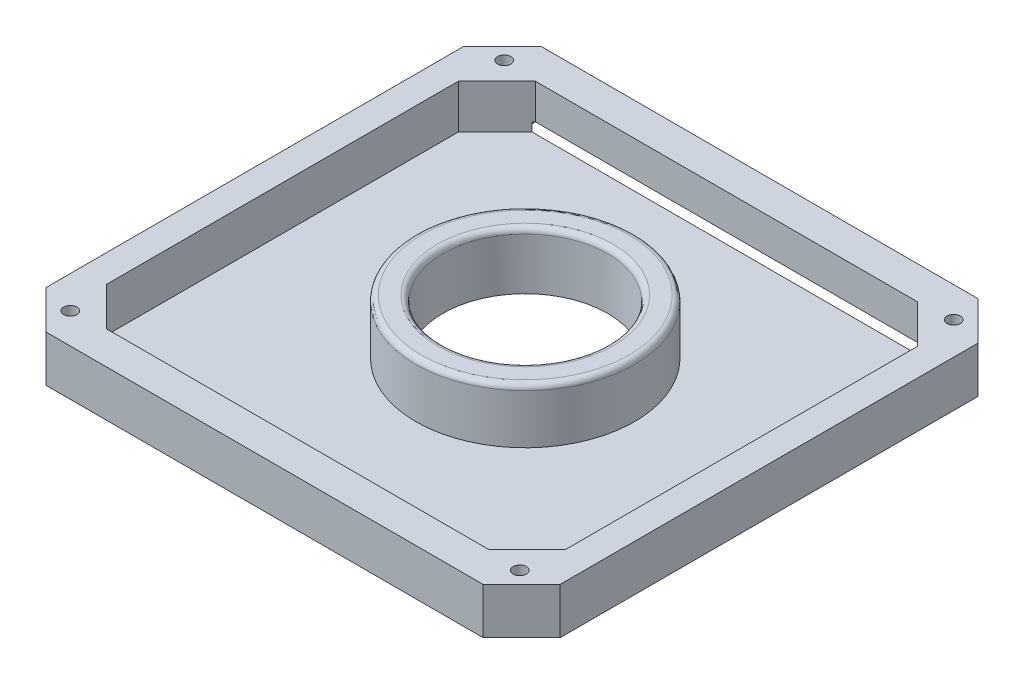
ISO-10303-21;
HEADER;
FILE_DESCRIPTION(('STEP AP214'),'2;1');
FILE_NAME('part.step','',(''),(''),'','','');
FILE_SCHEMA(('AUTOMOTIVE_DESIGN { 1 0 10303 214 1 1 1 1 }'));
ENDSEC;
DATA;
#1=APPLICATION_CONTEXT('core data for automotive mechanical design processes');
#2=APPLICATION_PROTOCOL_DEFINITION('international standard','automotive_design',2000,#1);
#3=PRODUCT_CONTEXT('',#1,'mechanical');
#4=PRODUCT('Part','Part','',(#3));
#5=PRODUCT_RELATED_PRODUCT_CATEGORY('part','',(#4));
#6=PRODUCT_DEFINITION_FORMATION('','',#4);
#7=PRODUCT_DEFINITION_CONTEXT('part definition',#1,'design');
#8=PRODUCT_DEFINITION('design','',#6,#7);
#9=PRODUCT_DEFINITION_SHAPE('','',#8);
#10=(LENGTH_UNIT() NAMED_UNIT(*) SI_UNIT(.MILLI.,.METRE.));
#11=(NAMED_UNIT(*) PLANE_ANGLE_UNIT() SI_UNIT($,.RADIAN.));
#12=(NAMED_UNIT(*) SI_UNIT($,.STERADIAN.) SOLID_ANGLE_UNIT());
#13=UNCERTAINTY_MEASURE_WITH_UNIT(LENGTH_MEASURE(1.E-05),#10,'distance_accuracy_value','');
#14=(GEOMETRIC_REPRESENTATION_CONTEXT(3) GLOBAL_UNCERTAINTY_ASSIGNED_CONTEXT((#13)) GLOBAL_UNIT_ASSIGNED_CONTEXT((#10,
#11,#12)) REPRESENTATION_CONTEXT('',''));
#15=CARTESIAN_POINT('',(0.,0.,0.));
#16=DIRECTION('',(0.,0.,1.));
#17=DIRECTION('',(1.,0.,0.));
#18=AXIS2_PLACEMENT_3D('',#15,#16,#17);
#19=CARTESIAN_POINT('',(-1.85465262789574E-12,9.4,-2.40478802439185));
#20=DIRECTION('',(0.,1.,0.));
#21=DIRECTION('',(0.,0.,1.));
#22=AXIS2_PLACEMENT_3D('',#19,#20,#21);
#23=TOROIDAL_SURFACE('',#22,18.9,1.);
#24=CARTESIAN_POINT('',(-1.85465262789574E-12,9.4,-2.40478802439185));
#25=DIRECTION('',(0.,-1.,0.));
#26=DIRECTION('',(0.,0.,-1.));
#27=AXIS2_PLACEMENT_3D('',#24,#25,#26);
#28=CIRCLE('',#27,19.9);
#29=CARTESIAN_POINT('',(-1.85465262789574E-12,9.4,-22.3047880243918));
#30=VERTEX_POINT('',#29);
#31=EDGE_CURVE('E412',#30,#30,#28,.T.);
#32=ORIENTED_EDGE('',*,*,#31,.F.);
#33=EDGE_LOOP('',(#32));
#34=FACE_BOUND('',#33,.T.);
#35=CARTESIAN_POINT('',(-1.85465262789574E-12,10.4,-2.40478802439185));
#36=DIRECTION('',(0.,-1.,0.));
#37=DIRECTION('',(0.,0.,-1.));
#38=AXIS2_PLACEMENT_3D('',#35,#36,#37);
#39=CIRCLE('',#38,18.9);
#40=CARTESIAN_POINT('',(-1.85465262789574E-12,10.4,16.4952119756081));
#41=VERTEX_POINT('',#40);
#42=CARTESIAN_POINT('',(-1.85326387842551E-12,10.4,-21.3047880243918));
#43=VERTEX_POINT('',#42);
#44=EDGE_CURVE('E405',#41,#43,#39,.F.);
#45=ORIENTED_EDGE('',*,*,#44,.F.);
#46=CARTESIAN_POINT('',(-1.85465262789574E-12,10.4,-2.40478802439185));
#47=DIRECTION('',(0.,-1.,0.));
#48=DIRECTION('',(0.,0.,1.));
#49=AXIS2_PLACEMENT_3D('',#46,#47,#48);
#50=CIRCLE('',#49,18.9);
#51=EDGE_CURVE('E403',#43,#41,#50,.F.);
#52=ORIENTED_EDGE('',*,*,#51,.F.);
#53=EDGE_LOOP('',(#45,#52));
#54=FACE_BOUND('',#53,.T.);
#55=ADVANCED_FACE('F17',(#34,#54),#23,.T.);
#56=CARTESIAN_POINT('',(-1.85465262789574E-12,10.4,-2.40478802439185));
#57=DIRECTION('',(0.,1.,0.));
#58=DIRECTION('',(0.,0.,1.));
#59=AXIS2_PLACEMENT_3D('',#56,#57,#58);
#60=PLANE('',#59);
#61=ORIENTED_EDGE('',*,*,#51,.T.);
#62=ORIENTED_EDGE('',*,*,#44,.T.);
#63=EDGE_LOOP('',(#61,#62));
#64=FACE_BOUND('',#63,.T.);
#65=CARTESIAN_POINT('',(-6.84106249782944E-12,10.4,-2.40478802439185));
#66=DIRECTION('',(0.,1.,0.));
#67=DIRECTION('',(-1.,0.,0.));
#68=AXIS2_PLACEMENT_3D('',#65,#66,#67);
#69=CIRCLE('',#68,16.);
#70=CARTESIAN_POINT('',(-16.0000000000068,10.4,-2.40478802439185));
#71=VERTEX_POINT('',#70);
#72=CARTESIAN_POINT('',(15.9999999999932,10.4,-2.40478802439185));
#73=VERTEX_POINT('',#72);
#74=EDGE_CURVE('E447',#71,#73,#69,.T.);
#75=ORIENTED_EDGE('',*,*,#74,.F.);
#76=CARTESIAN_POINT('',(-6.84106249782944E-12,10.4,-2.40478802439185));
#77=DIRECTION('',(0.,1.,0.));
#78=DIRECTION('',(1.,0.,0.));
#79=AXIS2_PLACEMENT_3D('',#76,#77,#78);
#80=CIRCLE('',#79,16.);
#81=EDGE_CURVE('E205',#73,#71,#80,.T.);
#82=ORIENTED_EDGE('',*,*,#81,.F.);
#83=EDGE_LOOP('',(#75,#82));
#84=FACE_BOUND('',#83,.T.);
#85=ADVANCED_FACE('F410',(#64,#84),#60,.T.);
#86=CARTESIAN_POINT('',(-1.85465262789574E-12,10.4,-2.40478802439185));
#87=DIRECTION('',(0.,-1.,0.));
#88=DIRECTION('',(0.,0.,-1.));
#89=AXIS2_PLACEMENT_3D('',#86,#87,#88);
#90=CYLINDRICAL_SURFACE('',#89,19.9);
#91=ORIENTED_EDGE('',*,*,#31,.T.);
#92=EDGE_LOOP('',(#91));
#93=FACE_BOUND('',#92,.T.);
#94=CARTESIAN_POINT('',(-1.85465262789574E-12,0.399999999999999,-2.40478802439185));
#95=DIRECTION('',(0.,-1.,0.));
#96=DIRECTION('',(0.,0.,-1.));
#97=AXIS2_PLACEMENT_3D('',#94,#95,#96);
#98=CIRCLE('',#97,19.9);
#99=CARTESIAN_POINT('',(-1.85465262789574E-12,0.399999999999999,-22.3047880243918));
#100=VERTEX_POINT('',#99);
#101=EDGE_CURVE('E204',#100,#100,#98,.F.);
#102=ORIENTED_EDGE('',*,*,#101,.T.);
#103=EDGE_LOOP('',(#102));
#104=FACE_BOUND('',#103,.T.);
#105=ADVANCED_FACE('F428',(#93,#104),#90,.T.);
#106=CARTESIAN_POINT('',(-34.75,0.400000000000001,39.));
#107=DIRECTION('',(0.,0.,1.));
#108=DIRECTION('',(1.,0.,0.));
#109=AXIS2_PLACEMENT_3D('',#106,#107,#108);
#110=PLANE('',#109);
#111=DIRECTION('',(0.,1.,0.));
#112=VECTOR('',#111,1.);
#113=CARTESIAN_POINT('',(34.75,0.400000000000001,39.));
#114=LINE('',#113,#112);
#115=CARTESIAN_POINT('',(34.75,8.4,39.));
#116=VERTEX_POINT('',#115);
#117=CARTESIAN_POINT('',(34.75,0.400000000000001,39.));
#118=VERTEX_POINT('',#117);
#119=EDGE_CURVE('E462',#116,#118,#114,.F.);
#120=ORIENTED_EDGE('',*,*,#119,.T.);
#121=DIRECTION('',(1.,0.,0.));
#122=VECTOR('',#121,1.);
#123=CARTESIAN_POINT('',(0.,0.400000000000001,39.));
#124=LINE('',#123,#122);
#125=CARTESIAN_POINT('',(-34.75,0.400000000000001,39.));
#126=VERTEX_POINT('',#125);
#127=EDGE_CURVE('E351',#118,#126,#124,.F.);
#128=ORIENTED_EDGE('',*,*,#127,.T.);
#129=DIRECTION('',(0.,1.,0.));
#130=VECTOR('',#129,1.);
#131=CARTESIAN_POINT('',(-34.75,0.400000000000001,39.));
#132=LINE('',#131,#130);
#133=CARTESIAN_POINT('',(-34.75,8.4,39.));
#134=VERTEX_POINT('',#133);
#135=EDGE_CURVE('E374',#126,#134,#132,.T.);
#136=ORIENTED_EDGE('',*,*,#135,.T.);
#137=DIRECTION('',(1.,0.,0.));
#138=VECTOR('',#137,1.);
#139=CARTESIAN_POINT('',(0.,8.4,39.));
#140=LINE('',#139,#138);
#141=EDGE_CURVE('E308',#134,#116,#140,.T.);
#142=ORIENTED_EDGE('',*,*,#141,.T.);
#143=EDGE_LOOP('',(#120,#128,#136,#142));
#144=FACE_BOUND('',#143,.T.);
#145=ADVANCED_FACE('F885',(#144),#110,.F.);
#146=CARTESIAN_POINT('',(34.75,0.400000000000001,39.));
#147=DIRECTION('',(0.707106781186548,0.,0.707106781186548));
#148=DIRECTION('',(0.707106781186548,0.,-0.707106781186548));
#149=AXIS2_PLACEMENT_3D('',#146,#147,#148);
#150=PLANE('',#149);
#151=DIRECTION('',(0.,1.,0.));
#152=VECTOR('',#151,1.);
#153=CARTESIAN_POINT('',(41.75,0.400000000000001,32.));
#154=LINE('',#153,#152);
#155=CARTESIAN_POINT('',(41.75,8.4,32.));
#156=VERTEX_POINT('',#155);
#157=CARTESIAN_POINT('',(41.75,0.400000000000001,32.));
#158=VERTEX_POINT('',#157);
#159=EDGE_CURVE('E460',#156,#158,#154,.F.);
#160=ORIENTED_EDGE('',*,*,#159,.T.);
#161=DIRECTION('',(-0.707106781186547,0.,0.707106781186547));
#162=VECTOR('',#161,1.);
#163=CARTESIAN_POINT('',(41.75,0.400000000000001,32.));
#164=LINE('',#163,#162);
#165=EDGE_CURVE('E353',#158,#118,#164,.T.);
#166=ORIENTED_EDGE('',*,*,#165,.T.);
#167=ORIENTED_EDGE('',*,*,#119,.F.);
#168=DIRECTION('',(0.707106781186547,0.,-0.707106781186547));
#169=VECTOR('',#168,1.);
#170=CARTESIAN_POINT('',(34.75,8.4,39.));
#171=LINE('',#170,#169);
#172=EDGE_CURVE('E306',#116,#156,#171,.T.);
#173=ORIENTED_EDGE('',*,*,#172,.T.);
#174=EDGE_LOOP('',(#160,#166,#167,#173));
#175=FACE_BOUND('',#174,.T.);
#176=ADVANCED_FACE('F875',(#175),#150,.F.);
#177=CARTESIAN_POINT('',(41.75,0.400000000000001,32.));
#178=DIRECTION('',(1.,0.,0.));
#179=DIRECTION('',(0.,0.,-1.));
#180=AXIS2_PLACEMENT_3D('',#177,#178,#179);
#181=PLANE('',#180);
#182=DIRECTION('',(0.,1.,0.));
#183=VECTOR('',#182,1.);
#184=CARTESIAN_POINT('',(41.75,0.400000000000001,-32.));
#185=LINE('',#184,#183);
#186=CARTESIAN_POINT('',(41.75,8.4,-32.));
#187=VERTEX_POINT('',#186);
#188=CARTESIAN_POINT('',(41.75,0.400000000000001,-32.));
#189=VERTEX_POINT('',#188);
#190=EDGE_CURVE('E457',#187,#189,#185,.F.);
#191=ORIENTED_EDGE('',*,*,#190,.T.);
#192=DIRECTION('',(0.,0.,-1.));
#193=VECTOR('',#192,1.);
#194=CARTESIAN_POINT('',(41.75,0.400000000000001,0.));
#195=LINE('',#194,#193);
#196=EDGE_CURVE('E356',#189,#158,#195,.F.);
#197=ORIENTED_EDGE('',*,*,#196,.T.);
#198=ORIENTED_EDGE('',*,*,#159,.F.);
#199=DIRECTION('',(0.,0.,-1.));
#200=VECTOR('',#199,1.);
#201=CARTESIAN_POINT('',(41.75,8.4,0.));
#202=LINE('',#201,#200);
#203=EDGE_CURVE('E303',#156,#187,#202,.T.);
#204=ORIENTED_EDGE('',*,*,#203,.T.);
#205=EDGE_LOOP('',(#191,#197,#198,#204));
#206=FACE_BOUND('',#205,.T.);
#207=ADVANCED_FACE('F866',(#206),#181,.F.);
#208=CARTESIAN_POINT('',(34.75,0.400000000000001,-39.));
#209=DIRECTION('',(0.707106781186548,0.,-0.707106781186547));
#210=DIRECTION('',(-0.707106781186547,0.,-0.707106781186548));
#211=AXIS2_PLACEMENT_3D('',#208,#209,#210);
#212=PLANE('',#211);
#213=DIRECTION('',(0.707106781186547,0.,0.707106781186547));
#214=VECTOR('',#213,1.);
#215=CARTESIAN_POINT('',(35.0452119756082,0.400000000000001,-38.7047880243918));
#216=LINE('',#215,#214);
#217=CARTESIAN_POINT('',(35.0452119756082,0.400000000000006,-38.7047880243918));
#218=VERTEX_POINT('',#217);
#219=EDGE_CURVE('E359',#218,#189,#216,.T.);
#220=ORIENTED_EDGE('',*,*,#219,.T.);
#221=ORIENTED_EDGE('',*,*,#190,.F.);
#222=DIRECTION('',(-0.707106781186547,0.,-0.707106781186547));
#223=VECTOR('',#222,1.);
#224=CARTESIAN_POINT('',(41.75,8.4,-32.));
#225=LINE('',#224,#223);
#226=CARTESIAN_POINT('',(34.75,8.4,-39.));
#227=VERTEX_POINT('',#226);
#228=EDGE_CURVE('E305',#187,#227,#225,.T.);
#229=ORIENTED_EDGE('',*,*,#228,.T.);
#230=DIRECTION('',(0.,1.,0.));
#231=VECTOR('',#230,1.);
#232=CARTESIAN_POINT('',(34.75,0.400000000000001,-39.));
#233=LINE('',#232,#231);
#234=CARTESIAN_POINT('',(34.75,2.,-39.));
#235=VERTEX_POINT('',#234);
#236=EDGE_CURVE('E465',#227,#235,#233,.F.);
#237=ORIENTED_EDGE('',*,*,#236,.T.);
#238=DIRECTION('',(-0.707106781186548,0.,-0.707106781186548));
#239=VECTOR('',#238,1.);
#240=CARTESIAN_POINT('',(35.0452119756082,2.,-38.7047880243918));
#241=LINE('',#240,#239);
#242=CARTESIAN_POINT('',(35.0452119756082,2.,-38.7047880243918));
#243=VERTEX_POINT('',#242);
#244=EDGE_CURVE('E338',#243,#235,#241,.T.);
#245=ORIENTED_EDGE('',*,*,#244,.F.);
#246=DIRECTION('',(0.,1.,0.));
#247=VECTOR('',#246,1.);
#248=CARTESIAN_POINT('',(35.0452119756082,0.400000000000001,-38.7047880243918));
#249=LINE('',#248,#247);
#250=EDGE_CURVE('E459',#218,#243,#249,.T.);
#251=ORIENTED_EDGE('',*,*,#250,.F.);
#252=EDGE_LOOP('',(#220,#221,#229,#237,#245,#251));
#253=FACE_BOUND('',#252,.T.);
#254=ADVANCED_FACE('F499',(#253),#212,.F.);
#255=CARTESIAN_POINT('',(-34.75,0.400000000000001,-39.));
#256=DIRECTION('',(0.,0.,-1.));
#257=DIRECTION('',(-1.,0.,0.));
#258=AXIS2_PLACEMENT_3D('',#255,#256,#257);
#259=PLANE('',#258);
#260=ORIENTED_EDGE('',*,*,#236,.F.);
#261=DIRECTION('',(1.,0.,0.));
#262=VECTOR('',#261,1.);
#263=CARTESIAN_POINT('',(0.,8.4,-39.));
#264=LINE('',#263,#262);
#265=CARTESIAN_POINT('',(-34.75,8.40000000000001,-39.));
#266=VERTEX_POINT('',#265);
#267=EDGE_CURVE('E488',#227,#266,#264,.F.);
#268=ORIENTED_EDGE('',*,*,#267,.T.);
#269=DIRECTION('',(0.,1.,0.));
#270=VECTOR('',#269,1.);
#271=CARTESIAN_POINT('',(-34.75,0.400000000000001,-39.));
#272=LINE('',#271,#270);
#273=CARTESIAN_POINT('',(-34.75,2.,-39.));
#274=VERTEX_POINT('',#273);
#275=EDGE_CURVE('E473',#266,#274,#272,.F.);
#276=ORIENTED_EDGE('',*,*,#275,.T.);
#277=DIRECTION('',(1.,0.,0.));
#278=VECTOR('',#277,1.);
#279=CARTESIAN_POINT('',(0.,2.,-39.));
#280=LINE('',#279,#278);
#281=EDGE_CURVE('E310',#235,#274,#280,.F.);
#282=ORIENTED_EDGE('',*,*,#281,.F.);
#283=EDGE_LOOP('',(#260,#268,#276,#282));
#284=FACE_BOUND('',#283,.T.);
#285=ADVANCED_FACE('F486',(#284),#259,.F.);
#286=CARTESIAN_POINT('',(-41.75,0.400000000000001,-32.));
#287=DIRECTION('',(-0.707106781186548,0.,-0.707106781186548));
#288=DIRECTION('',(-0.707106781186548,0.,0.707106781186548));
#289=AXIS2_PLACEMENT_3D('',#286,#287,#288);
#290=PLANE('',#289);
#291=DIRECTION('',(-0.707106781186548,0.,0.707106781186548));
#292=VECTOR('',#291,1.);
#293=CARTESIAN_POINT('',(-34.75,2.,-39.));
#294=LINE('',#293,#292);
#295=CARTESIAN_POINT('',(-35.0452119756082,2.,-38.7047880243918));
#296=VERTEX_POINT('',#295);
#297=EDGE_CURVE('E363',#274,#296,#294,.T.);
#298=ORIENTED_EDGE('',*,*,#297,.F.);
#299=ORIENTED_EDGE('',*,*,#275,.F.);
#300=DIRECTION('',(-0.707106781186547,0.,0.707106781186547));
#301=VECTOR('',#300,1.);
#302=CARTESIAN_POINT('',(-34.75,8.4,-39.));
#303=LINE('',#302,#301);
#304=CARTESIAN_POINT('',(-41.75,8.4,-32.));
#305=VERTEX_POINT('',#304);
#306=EDGE_CURVE('E302',#266,#305,#303,.T.);
#307=ORIENTED_EDGE('',*,*,#306,.T.);
#308=DIRECTION('',(0.,1.,0.));
#309=VECTOR('',#308,1.);
#310=CARTESIAN_POINT('',(-41.75,0.400000000000001,-32.));
#311=LINE('',#310,#309);
#312=CARTESIAN_POINT('',(-41.75,0.400000000000001,-32.));
#313=VERTEX_POINT('',#312);
#314=EDGE_CURVE('E451',#305,#313,#311,.F.);
#315=ORIENTED_EDGE('',*,*,#314,.T.);
#316=DIRECTION('',(0.707106781186547,0.,-0.707106781186547));
#317=VECTOR('',#316,1.);
#318=CARTESIAN_POINT('',(-41.75,0.400000000000001,-32.));
#319=LINE('',#318,#317);
#320=CARTESIAN_POINT('',(-35.0452119756082,0.400000000000001,-38.7047880243918));
#321=VERTEX_POINT('',#320);
#322=EDGE_CURVE('E347',#313,#321,#319,.T.);
#323=ORIENTED_EDGE('',*,*,#322,.T.);
#324=DIRECTION('',(0.,1.,0.));
#325=VECTOR('',#324,1.);
#326=CARTESIAN_POINT('',(-35.0452119756082,0.400000000000001,-38.7047880243918));
#327=LINE('',#326,#325);
#328=EDGE_CURVE('E454',#296,#321,#327,.F.);
#329=ORIENTED_EDGE('',*,*,#328,.F.);
#330=EDGE_LOOP('',(#298,#299,#307,#315,#323,#329));
#331=FACE_BOUND('',#330,.T.);
#332=ADVANCED_FACE('F491',(#331),#290,.F.);
#333=CARTESIAN_POINT('',(-41.75,0.400000000000001,32.));
#334=DIRECTION('',(-1.,0.,0.));
#335=DIRECTION('',(0.,0.,1.));
#336=AXIS2_PLACEMENT_3D('',#333,#334,#335);
#337=PLANE('',#336);
#338=DIRECTION('',(0.,1.,0.));
#339=VECTOR('',#338,1.);
#340=CARTESIAN_POINT('',(-41.75,0.400000000000001,32.));
#341=LINE('',#340,#339);
#342=CARTESIAN_POINT('',(-41.75,8.4,32.));
#343=VERTEX_POINT('',#342);
#344=CARTESIAN_POINT('',(-41.75,0.400000000000001,32.));
#345=VERTEX_POINT('',#344);
#346=EDGE_CURVE('E448',#343,#345,#341,.F.);
#347=ORIENTED_EDGE('',*,*,#346,.T.);
#348=DIRECTION('',(0.,0.,-1.));
#349=VECTOR('',#348,1.);
#350=CARTESIAN_POINT('',(-41.75,0.400000000000001,0.));
#351=LINE('',#350,#349);
#352=EDGE_CURVE('E344',#345,#313,#351,.T.);
#353=ORIENTED_EDGE('',*,*,#352,.T.);
#354=ORIENTED_EDGE('',*,*,#314,.F.);
#355=DIRECTION('',(0.,0.,-1.));
#356=VECTOR('',#355,1.);
#357=CARTESIAN_POINT('',(-41.75,8.4,0.));
#358=LINE('',#357,#356);
#359=EDGE_CURVE('E300',#305,#343,#358,.F.);
#360=ORIENTED_EDGE('',*,*,#359,.T.);
#361=EDGE_LOOP('',(#347,#353,#354,#360));
#362=FACE_BOUND('',#361,.T.);
#363=ADVANCED_FACE('F835',(#362),#337,.F.);
#364=CARTESIAN_POINT('',(-41.75,0.400000000000001,32.));
#365=DIRECTION('',(-0.707106781186548,0.,0.707106781186548));
#366=DIRECTION('',(0.707106781186548,0.,0.707106781186548));
#367=AXIS2_PLACEMENT_3D('',#364,#365,#366);
#368=PLANE('',#367);
#369=ORIENTED_EDGE('',*,*,#135,.F.);
#370=DIRECTION('',(-0.707106781186547,0.,-0.707106781186547));
#371=VECTOR('',#370,1.);
#372=CARTESIAN_POINT('',(-34.75,0.400000000000001,39.));
#373=LINE('',#372,#371);
#374=EDGE_CURVE('E348',#126,#345,#373,.T.);
#375=ORIENTED_EDGE('',*,*,#374,.T.);
#376=ORIENTED_EDGE('',*,*,#346,.F.);
#377=DIRECTION('',(0.707106781186547,0.,0.707106781186547));
#378=VECTOR('',#377,1.);
#379=CARTESIAN_POINT('',(-41.75,8.4,32.));
#380=LINE('',#379,#378);
#381=EDGE_CURVE('E296',#343,#134,#380,.T.);
#382=ORIENTED_EDGE('',*,*,#381,.T.);
#383=EDGE_LOOP('',(#369,#375,#376,#382));
#384=FACE_BOUND('',#383,.T.);
#385=ADVANCED_FACE('F382',(#384),#368,.F.);
#386=CARTESIAN_POINT('',(-6.84106249782944E-12,9.4,-2.40478802439185));
#387=DIRECTION('',(0.,1.,0.));
#388=DIRECTION('',(1.,0.,0.));
#389=AXIS2_PLACEMENT_3D('',#386,#387,#388);
#390=TOROIDAL_SURFACE('',#389,16.,1.);
#391=ORIENTED_EDGE('',*,*,#74,.T.);
#392=ORIENTED_EDGE('',*,*,#81,.T.);
#393=EDGE_LOOP('',(#391,#392));
#394=FACE_BOUND('',#393,.T.);
#395=CARTESIAN_POINT('',(-6.84106249782944E-12,9.4,-2.40478802439185));
#396=DIRECTION('',(0.,1.,0.));
#397=DIRECTION('',(0.,0.,1.));
#398=AXIS2_PLACEMENT_3D('',#395,#396,#397);
#399=CIRCLE('',#398,15.);
#400=CARTESIAN_POINT('',(-6.84106249782944E-12,9.4,12.5952119756081));
#401=VERTEX_POINT('',#400);
#402=EDGE_CURVE('E299',#401,#401,#399,.F.);
#403=ORIENTED_EDGE('',*,*,#402,.T.);
#404=EDGE_LOOP('',(#403));
#405=FACE_BOUND('',#404,.T.);
#406=ADVANCED_FACE('F377',(#394,#405),#390,.T.);
#407=CARTESIAN_POINT('',(-35.75,0.,-39.7047880243918));
#408=DIRECTION('',(0.,-1.,0.));
#409=DIRECTION('',(0.,0.,-1.));
#410=AXIS2_PLACEMENT_3D('',#407,#408,#409);
#411=CYLINDRICAL_SURFACE('',#410,1.);
#412=CARTESIAN_POINT('',(-35.75,0.,-39.7047880243918));
#413=DIRECTION('',(0.,-1.,0.));
#414=DIRECTION('',(0.,0.,-1.));
#415=AXIS2_PLACEMENT_3D('',#412,#413,#414);
#416=CIRCLE('',#415,1.);
#417=CARTESIAN_POINT('',(-36.75,0.,-39.7047880243918));
#418=VERTEX_POINT('',#417);
#419=CARTESIAN_POINT('',(-35.75,0.,-38.7047880243918));
#420=VERTEX_POINT('',#419);
#421=EDGE_CURVE('E191',#418,#420,#416,.F.);
#422=ORIENTED_EDGE('',*,*,#421,.F.);
#423=DIRECTION('',(0.,1.,0.));
#424=VECTOR('',#423,1.);
#425=CARTESIAN_POINT('',(-36.75,-162.561574872416,-39.7047880243918));
#426=LINE('',#425,#424);
#427=CARTESIAN_POINT('',(-36.75,2.,-39.7047880243918));
#428=VERTEX_POINT('',#427);
#429=EDGE_CURVE('E277',#428,#418,#426,.F.);
#430=ORIENTED_EDGE('',*,*,#429,.F.);
#431=CARTESIAN_POINT('',(-35.75,2.,-39.7047880243918));
#432=DIRECTION('',(0.,-1.,0.));
#433=DIRECTION('',(0.,0.,-1.));
#434=AXIS2_PLACEMENT_3D('',#431,#432,#433);
#435=CIRCLE('',#434,1.);
#436=CARTESIAN_POINT('',(-35.75,2.,-38.7047880243918));
#437=VERTEX_POINT('',#436);
#438=EDGE_CURVE('E211',#437,#428,#435,.T.);
#439=ORIENTED_EDGE('',*,*,#438,.F.);
#440=DIRECTION('',(0.,1.,0.));
#441=VECTOR('',#440,1.);
#442=CARTESIAN_POINT('',(-35.75,-162.561574872416,-38.7047880243918));
#443=LINE('',#442,#441);
#444=EDGE_CURVE('E208',#420,#437,#443,.T.);
#445=ORIENTED_EDGE('',*,*,#444,.F.);
#446=EDGE_LOOP('',(#422,#430,#439,#445));
#447=FACE_BOUND('',#446,.T.);
#448=ADVANCED_FACE('F209',(#447),#411,.F.);
#449=CARTESIAN_POINT('',(0.,0.400000000000001,0.));
#450=DIRECTION('',(0.,-1.,0.));
#451=DIRECTION('',(0.,0.,-1.));
#452=AXIS2_PLACEMENT_3D('',#449,#450,#451);
#453=PLANE('',#452);
#454=ORIENTED_EDGE('',*,*,#322,.F.);
#455=ORIENTED_EDGE('',*,*,#352,.F.);
#456=ORIENTED_EDGE('',*,*,#374,.F.);
#457=ORIENTED_EDGE('',*,*,#127,.F.);
#458=ORIENTED_EDGE('',*,*,#165,.F.);
#459=ORIENTED_EDGE('',*,*,#196,.F.);
#460=ORIENTED_EDGE('',*,*,#219,.F.);
#461=DIRECTION('',(-1.,0.,0.));
#462=VECTOR('',#461,1.);
#463=CARTESIAN_POINT('',(35.75,0.400000000000011,-38.7047880243918));
#464=LINE('',#463,#462);
#465=EDGE_CURVE('E335',#321,#218,#464,.F.);
#466=ORIENTED_EDGE('',*,*,#465,.F.);
#467=EDGE_LOOP('',(#454,#455,#456,#457,#458,#459,#460,#466));
#468=FACE_BOUND('',#467,.T.);
#469=ORIENTED_EDGE('',*,*,#101,.F.);
#470=EDGE_LOOP('',(#469));
#471=FACE_BOUND('',#470,.T.);
#472=ADVANCED_FACE('F565',(#468,#471),#453,.F.);
#473=CARTESIAN_POINT('',(35.75,0.,-39.7047880243918));
#474=DIRECTION('',(0.,-1.,0.));
#475=DIRECTION('',(0.,0.,-1.));
#476=AXIS2_PLACEMENT_3D('',#473,#474,#475);
#477=CYLINDRICAL_SURFACE('',#476,1.);
#478=CARTESIAN_POINT('',(35.75,0.,-39.7047880243918));
#479=DIRECTION('',(0.,-1.,0.));
#480=DIRECTION('',(0.,0.,-1.));
#481=AXIS2_PLACEMENT_3D('',#478,#479,#480);
#482=CIRCLE('',#481,1.);
#483=CARTESIAN_POINT('',(35.75,0.,-38.7047880243918));
#484=VERTEX_POINT('',#483);
#485=CARTESIAN_POINT('',(36.75,0.,-39.7047880243918));
#486=VERTEX_POINT('',#485);
#487=EDGE_CURVE('E366',#484,#486,#482,.F.);
#488=ORIENTED_EDGE('',*,*,#487,.F.);
#489=DIRECTION('',(0.,1.,0.));
#490=VECTOR('',#489,1.);
#491=CARTESIAN_POINT('',(35.75,-162.561574872416,-38.7047880243918));
#492=LINE('',#491,#490);
#493=CARTESIAN_POINT('',(35.75,2.,-38.7047880243918));
#494=VERTEX_POINT('',#493);
#495=EDGE_CURVE('E222',#494,#484,#492,.F.);
#496=ORIENTED_EDGE('',*,*,#495,.F.);
#497=CARTESIAN_POINT('',(35.75,2.,-39.7047880243918));
#498=DIRECTION('',(0.,-1.,0.));
#499=DIRECTION('',(0.,0.,-1.));
#500=AXIS2_PLACEMENT_3D('',#497,#498,#499);
#501=CIRCLE('',#500,1.);
#502=CARTESIAN_POINT('',(36.75,2.,-39.7047880243918));
#503=VERTEX_POINT('',#502);
#504=EDGE_CURVE('E341',#503,#494,#501,.T.);
#505=ORIENTED_EDGE('',*,*,#504,.F.);
#506=DIRECTION('',(0.,1.,0.));
#507=VECTOR('',#506,1.);
#508=CARTESIAN_POINT('',(36.75,-162.561574872416,-39.7047880243918));
#509=LINE('',#508,#507);
#510=EDGE_CURVE('E260',#486,#503,#509,.T.);
#511=ORIENTED_EDGE('',*,*,#510,.F.);
#512=EDGE_LOOP('',(#488,#496,#505,#511));
#513=FACE_BOUND('',#512,.T.);
#514=ADVANCED_FACE('F567',(#513),#477,.F.);
#515=CARTESIAN_POINT('',(0.,2.,0.));
#516=DIRECTION('',(0.,-1.,0.));
#517=DIRECTION('',(0.,0.,-1.));
#518=AXIS2_PLACEMENT_3D('',#515,#516,#517);
#519=PLANE('',#518);
#520=ORIENTED_EDGE('',*,*,#244,.T.);
#521=ORIENTED_EDGE('',*,*,#281,.T.);
#522=ORIENTED_EDGE('',*,*,#297,.T.);
#523=DIRECTION('',(-1.,0.,0.));
#524=VECTOR('',#523,1.);
#525=CARTESIAN_POINT('',(35.75,2.,-38.7047880243918));
#526=LINE('',#525,#524);
#527=EDGE_CURVE('E215',#437,#296,#526,.F.);
#528=ORIENTED_EDGE('',*,*,#527,.F.);
#529=ORIENTED_EDGE('',*,*,#438,.T.);
#530=DIRECTION('',(0.,0.,-1.));
#531=VECTOR('',#530,1.);
#532=CARTESIAN_POINT('',(-36.75,2.,-39.7047880243918));
#533=LINE('',#532,#531);
#534=CARTESIAN_POINT('',(-36.75,2.,-45.));
#535=VERTEX_POINT('',#534);
#536=EDGE_CURVE('E216',#535,#428,#533,.F.);
#537=ORIENTED_EDGE('',*,*,#536,.F.);
#538=DIRECTION('',(1.,0.,0.));
#539=VECTOR('',#538,1.);
#540=CARTESIAN_POINT('',(-39.75,2.,-45.));
#541=LINE('',#540,#539);
#542=CARTESIAN_POINT('',(36.75,2.,-45.));
#543=VERTEX_POINT('',#542);
#544=EDGE_CURVE('E272',#535,#543,#541,.T.);
#545=ORIENTED_EDGE('',*,*,#544,.T.);
#546=DIRECTION('',(0.,0.,1.));
#547=VECTOR('',#546,1.);
#548=CARTESIAN_POINT('',(36.75,2.,-45.));
#549=LINE('',#548,#547);
#550=EDGE_CURVE('E263',#503,#543,#549,.F.);
#551=ORIENTED_EDGE('',*,*,#550,.F.);
#552=ORIENTED_EDGE('',*,*,#504,.T.);
#553=DIRECTION('',(-1.,0.,0.));
#554=VECTOR('',#553,1.);
#555=CARTESIAN_POINT('',(35.75,2.,-38.7047880243918));
#556=LINE('',#555,#554);
#557=EDGE_CURVE('E276',#243,#494,#556,.F.);
#558=ORIENTED_EDGE('',*,*,#557,.F.);
#559=EDGE_LOOP('',(#520,#521,#522,#528,#529,#537,#545,#551,#552,#558));
#560=FACE_BOUND('',#559,.T.);
#561=ADVANCED_FACE('F494',(#560),#519,.T.);
#562=CARTESIAN_POINT('',(0.,8.4,0.));
#563=DIRECTION('',(0.,-1.,0.));
#564=DIRECTION('',(0.,0.,-1.));
#565=AXIS2_PLACEMENT_3D('',#562,#563,#564);
#566=PLANE('',#565);
#567=ORIENTED_EDGE('',*,*,#359,.F.);
#568=ORIENTED_EDGE('',*,*,#306,.F.);
#569=ORIENTED_EDGE('',*,*,#267,.F.);
#570=ORIENTED_EDGE('',*,*,#228,.F.);
#571=ORIENTED_EDGE('',*,*,#203,.F.);
#572=ORIENTED_EDGE('',*,*,#172,.F.);
#573=ORIENTED_EDGE('',*,*,#141,.F.);
#574=ORIENTED_EDGE('',*,*,#381,.F.);
#575=EDGE_LOOP('',(#567,#568,#569,#570,#571,#572,#573,#574));
#576=FACE_BOUND('',#575,.T.);
#577=CARTESIAN_POINT('',(40.8711804126844,8.4,-39.4578599479724));
#578=DIRECTION('',(0.,1.,0.));
#579=DIRECTION('',(0.,0.,1.));
#580=AXIS2_PLACEMENT_3D('',#577,#578,#579);
#581=CIRCLE('',#580,1.19999999999999);
#582=CARTESIAN_POINT('',(40.8711804126844,8.4,-38.2578599479724));
#583=VERTEX_POINT('',#582);
#584=EDGE_CURVE('E553',#583,#583,#581,.F.);
#585=ORIENTED_EDGE('',*,*,#584,.T.);
#586=EDGE_LOOP('',(#585));
#587=FACE_BOUND('',#586,.T.);
#588=CARTESIAN_POINT('',(-40.8711804126844,8.4,-39.4578599479724));
#589=DIRECTION('',(0.,1.,0.));
#590=DIRECTION('',(0.,0.,1.));
#591=AXIS2_PLACEMENT_3D('',#588,#589,#590);
#592=CIRCLE('',#591,1.19999999999999);
#593=CARTESIAN_POINT('',(-40.8711804126844,8.4,-38.2578599479724));
#594=VERTEX_POINT('',#593);
#595=EDGE_CURVE('E550',#594,#594,#592,.F.);
#596=ORIENTED_EDGE('',*,*,#595,.T.);
#597=EDGE_LOOP('',(#596));
#598=FACE_BOUND('',#597,.T.);
#599=CARTESIAN_POINT('',(-40.8711804126844,8.4,39.4578599479724));
#600=DIRECTION('',(0.,1.,0.));
#601=DIRECTION('',(0.,0.,1.));
#602=AXIS2_PLACEMENT_3D('',#599,#600,#601);
#603=CIRCLE('',#602,1.19999999999999);
#604=CARTESIAN_POINT('',(-40.8711804126844,8.4,40.6578599479724));
#605=VERTEX_POINT('',#604);
#606=EDGE_CURVE('E279',#605,#605,#603,.F.);
#607=ORIENTED_EDGE('',*,*,#606,.T.);
#608=EDGE_LOOP('',(#607));
#609=FACE_BOUND('',#608,.T.);
#610=CARTESIAN_POINT('',(40.8711804126844,8.4,39.4578599479724));
#611=DIRECTION('',(0.,1.,0.));
#612=DIRECTION('',(0.,0.,1.));
#613=AXIS2_PLACEMENT_3D('',#610,#611,#612);
#614=CIRCLE('',#613,1.19999999999999);
#615=CARTESIAN_POINT('',(40.8711804126844,8.4,40.6578599479724));
#616=VERTEX_POINT('',#615);
#617=EDGE_CURVE('E371',#616,#616,#614,.F.);
#618=ORIENTED_EDGE('',*,*,#617,.T.);
#619=EDGE_LOOP('',(#618));
#620=FACE_BOUND('',#619,.T.);
#621=DIRECTION('',(-0.707106781186548,0.,-0.707106781186548));
#622=VECTOR('',#621,1.);
#623=CARTESIAN_POINT('',(-39.75,8.4,45.));
#624=LINE('',#623,#622);
#625=CARTESIAN_POINT('',(-46.75,8.4,38.));
#626=VERTEX_POINT('',#625);
#627=CARTESIAN_POINT('',(-39.75,8.4,45.));
#628=VERTEX_POINT('',#627);
#629=EDGE_CURVE('E245',#626,#628,#624,.F.);
#630=ORIENTED_EDGE('',*,*,#629,.T.);
#631=DIRECTION('',(-1.,0.,0.));
#632=VECTOR('',#631,1.);
#633=CARTESIAN_POINT('',(-39.75,8.4,45.));
#634=LINE('',#633,#632);
#635=CARTESIAN_POINT('',(39.75,8.4,45.));
#636=VERTEX_POINT('',#635);
#637=EDGE_CURVE('E249',#628,#636,#634,.F.);
#638=ORIENTED_EDGE('',*,*,#637,.T.);
#639=DIRECTION('',(-0.707106781186548,0.,0.707106781186547));
#640=VECTOR('',#639,1.);
#641=CARTESIAN_POINT('',(39.75,8.4,45.));
#642=LINE('',#641,#640);
#643=CARTESIAN_POINT('',(46.75,8.4,38.));
#644=VERTEX_POINT('',#643);
#645=EDGE_CURVE('E253',#636,#644,#642,.F.);
#646=ORIENTED_EDGE('',*,*,#645,.T.);
#647=DIRECTION('',(0.,0.,1.));
#648=VECTOR('',#647,1.);
#649=CARTESIAN_POINT('',(46.75,8.4,38.));
#650=LINE('',#649,#648);
#651=CARTESIAN_POINT('',(46.75,8.4,-38.));
#652=VERTEX_POINT('',#651);
#653=EDGE_CURVE('E257',#644,#652,#650,.F.);
#654=ORIENTED_EDGE('',*,*,#653,.T.);
#655=DIRECTION('',(0.707106781186548,0.,0.707106781186548));
#656=VECTOR('',#655,1.);
#657=CARTESIAN_POINT('',(39.75,8.4,-45.));
#658=LINE('',#657,#656);
#659=CARTESIAN_POINT('',(39.75,8.4,-45.));
#660=VERTEX_POINT('',#659);
#661=EDGE_CURVE('E287',#652,#660,#658,.F.);
#662=ORIENTED_EDGE('',*,*,#661,.T.);
#663=DIRECTION('',(1.,0.,0.));
#664=VECTOR('',#663,1.);
#665=CARTESIAN_POINT('',(-39.75,8.4,-45.));
#666=LINE('',#665,#664);
#667=CARTESIAN_POINT('',(-39.75,8.4,-45.));
#668=VERTEX_POINT('',#667);
#669=EDGE_CURVE('E271',#660,#668,#666,.F.);
#670=ORIENTED_EDGE('',*,*,#669,.T.);
#671=DIRECTION('',(0.707106781186548,0.,-0.707106781186548));
#672=VECTOR('',#671,1.);
#673=CARTESIAN_POINT('',(-46.75,8.4,-38.));
#674=LINE('',#673,#672);
#675=CARTESIAN_POINT('',(-46.75,8.4,-38.));
#676=VERTEX_POINT('',#675);
#677=EDGE_CURVE('E237',#668,#676,#674,.F.);
#678=ORIENTED_EDGE('',*,*,#677,.T.);
#679=DIRECTION('',(0.,0.,-1.));
#680=VECTOR('',#679,1.);
#681=CARTESIAN_POINT('',(-46.75,8.4,38.));
#682=LINE('',#681,#680);
#683=EDGE_CURVE('E241',#676,#626,#682,.F.);
#684=ORIENTED_EDGE('',*,*,#683,.T.);
#685=EDGE_LOOP('',(#630,#638,#646,#654,#662,#670,#678,#684));
#686=FACE_BOUND('',#685,.T.);
#687=ADVANCED_FACE('F505',(#576,#587,#598,#609,#620,#686),#566,.F.);
#688=CARTESIAN_POINT('',(-6.84106249782944E-12,-1.07120000000002,-2.40478802439185));
#689=DIRECTION('',(0.,1.,0.));
#690=DIRECTION('',(0.,0.,1.));
#691=AXIS2_PLACEMENT_3D('',#688,#689,#690);
#692=CYLINDRICAL_SURFACE('',#691,15.);
#693=ORIENTED_EDGE('',*,*,#402,.F.);
#694=EDGE_LOOP('',(#693));
#695=FACE_BOUND('',#694,.T.);
#696=CARTESIAN_POINT('',(-6.84106249782944E-12,0.,-2.40478802439185));
#697=DIRECTION('',(0.,1.,0.));
#698=DIRECTION('',(0.,0.,1.));
#699=AXIS2_PLACEMENT_3D('',#696,#697,#698);
#700=CIRCLE('',#699,15.);
#701=CARTESIAN_POINT('',(-6.84106249782944E-12,0.,12.5952119756081));
#702=VERTEX_POINT('',#701);
#703=EDGE_CURVE('E236',#702,#702,#700,.T.);
#704=ORIENTED_EDGE('',*,*,#703,.F.);
#705=EDGE_LOOP('',(#704));
#706=FACE_BOUND('',#705,.T.);
#707=ADVANCED_FACE('F638',(#695,#706),#692,.F.);
#708=CARTESIAN_POINT('',(40.8711804126844,8.4,39.4578599479724));
#709=DIRECTION('',(0.,1.,0.));
#710=DIRECTION('',(0.,0.,1.));
#711=AXIS2_PLACEMENT_3D('',#708,#709,#710);
#712=CYLINDRICAL_SURFACE('',#711,1.19999999999999);
#713=CARTESIAN_POINT('',(40.8711804126844,0.,39.4578599479724));
#714=DIRECTION('',(0.,1.,0.));
#715=DIRECTION('',(0.,0.,1.));
#716=AXIS2_PLACEMENT_3D('',#713,#714,#715);
#717=CIRCLE('',#716,1.19999999999999);
#718=CARTESIAN_POINT('',(40.8711804126844,0.,40.6578599479724));
#719=VERTEX_POINT('',#718);
#720=EDGE_CURVE('E543',#719,#719,#717,.T.);
#721=ORIENTED_EDGE('',*,*,#720,.F.);
#722=EDGE_LOOP('',(#721));
#723=FACE_BOUND('',#722,.T.);
#724=ORIENTED_EDGE('',*,*,#617,.F.);
#725=EDGE_LOOP('',(#724));
#726=FACE_BOUND('',#725,.T.);
#727=ADVANCED_FACE('F634',(#723,#726),#712,.F.);
#728=CARTESIAN_POINT('',(40.8711804126844,8.4,-39.4578599479724));
#729=DIRECTION('',(0.,1.,0.));
#730=DIRECTION('',(0.,0.,1.));
#731=AXIS2_PLACEMENT_3D('',#728,#729,#730);
#732=CYLINDRICAL_SURFACE('',#731,1.19999999999999);
#733=CARTESIAN_POINT('',(40.8711804126844,0.,-39.4578599479724));
#734=DIRECTION('',(0.,1.,0.));
#735=DIRECTION('',(0.,0.,1.));
#736=AXIS2_PLACEMENT_3D('',#733,#734,#735);
#737=CIRCLE('',#736,1.19999999999999);
#738=CARTESIAN_POINT('',(40.8711804126844,0.,-38.2578599479724));
#739=VERTEX_POINT('',#738);
#740=EDGE_CURVE('E540',#739,#739,#737,.T.);
#741=ORIENTED_EDGE('',*,*,#740,.F.);
#742=EDGE_LOOP('',(#741));
#743=FACE_BOUND('',#742,.T.);
#744=ORIENTED_EDGE('',*,*,#584,.F.);
#745=EDGE_LOOP('',(#744));
#746=FACE_BOUND('',#745,.T.);
#747=ADVANCED_FACE('F630',(#743,#746),#732,.F.);
#748=CARTESIAN_POINT('',(-40.8711804126844,8.4,-39.4578599479724));
#749=DIRECTION('',(0.,1.,0.));
#750=DIRECTION('',(0.,0.,1.));
#751=AXIS2_PLACEMENT_3D('',#748,#749,#750);
#752=CYLINDRICAL_SURFACE('',#751,1.19999999999999);
#753=CARTESIAN_POINT('',(-40.8711804126844,0.,-39.4578599479724));
#754=DIRECTION('',(0.,1.,0.));
#755=DIRECTION('',(0.,0.,1.));
#756=AXIS2_PLACEMENT_3D('',#753,#754,#755);
#757=CIRCLE('',#756,1.19999999999999);
#758=CARTESIAN_POINT('',(-40.8711804126844,0.,-38.2578599479724));
#759=VERTEX_POINT('',#758);
#760=EDGE_CURVE('E537',#759,#759,#757,.T.);
#761=ORIENTED_EDGE('',*,*,#760,.F.);
#762=EDGE_LOOP('',(#761));
#763=FACE_BOUND('',#762,.T.);
#764=ORIENTED_EDGE('',*,*,#595,.F.);
#765=EDGE_LOOP('',(#764));
#766=FACE_BOUND('',#765,.T.);
#767=ADVANCED_FACE('F626',(#763,#766),#752,.F.);
#768=CARTESIAN_POINT('',(-40.8711804126844,8.4,39.4578599479724));
#769=DIRECTION('',(0.,1.,0.));
#770=DIRECTION('',(0.,0.,1.));
#771=AXIS2_PLACEMENT_3D('',#768,#769,#770);
#772=CYLINDRICAL_SURFACE('',#771,1.19999999999999);
#773=CARTESIAN_POINT('',(-40.8711804126844,0.,39.4578599479724));
#774=DIRECTION('',(0.,1.,0.));
#775=DIRECTION('',(0.,0.,1.));
#776=AXIS2_PLACEMENT_3D('',#773,#774,#775);
#777=CIRCLE('',#776,1.19999999999999);
#778=CARTESIAN_POINT('',(-40.8711804126844,0.,40.6578599479724));
#779=VERTEX_POINT('',#778);
#780=EDGE_CURVE('E281',#779,#779,#777,.T.);
#781=ORIENTED_EDGE('',*,*,#780,.F.);
#782=EDGE_LOOP('',(#781));
#783=FACE_BOUND('',#782,.T.);
#784=ORIENTED_EDGE('',*,*,#606,.F.);
#785=EDGE_LOOP('',(#784));
#786=FACE_BOUND('',#785,.T.);
#787=ADVANCED_FACE('F622',(#783,#786),#772,.F.);
#788=CARTESIAN_POINT('',(-36.75,-162.561574872416,-39.7047880243918));
#789=DIRECTION('',(1.,0.,0.));
#790=DIRECTION('',(0.,0.,-1.));
#791=AXIS2_PLACEMENT_3D('',#788,#789,#790);
#792=PLANE('',#791);
#793=DIRECTION('',(0.,1.,0.));
#794=VECTOR('',#793,1.);
#795=CARTESIAN_POINT('',(-36.75,8.4,-45.));
#796=LINE('',#795,#794);
#797=CARTESIAN_POINT('',(-36.75,0.,-45.));
#798=VERTEX_POINT('',#797);
#799=EDGE_CURVE('E284',#798,#535,#796,.T.);
#800=ORIENTED_EDGE('',*,*,#799,.T.);
#801=ORIENTED_EDGE('',*,*,#536,.T.);
#802=ORIENTED_EDGE('',*,*,#429,.T.);
#803=DIRECTION('',(0.,0.,-1.));
#804=VECTOR('',#803,1.);
#805=CARTESIAN_POINT('',(-36.75,0.,0.));
#806=LINE('',#805,#804);
#807=EDGE_CURVE('E203',#798,#418,#806,.F.);
#808=ORIENTED_EDGE('',*,*,#807,.F.);
#809=EDGE_LOOP('',(#800,#801,#802,#808));
#810=FACE_BOUND('',#809,.T.);
#811=ADVANCED_FACE('F619',(#810),#792,.T.);
#812=CARTESIAN_POINT('',(35.75,-162.561574872416,-38.7047880243918));
#813=DIRECTION('',(0.,0.,-1.));
#814=DIRECTION('',(-1.,0.,0.));
#815=AXIS2_PLACEMENT_3D('',#812,#813,#814);
#816=PLANE('',#815);
#817=ORIENTED_EDGE('',*,*,#495,.T.);
#818=DIRECTION('',(1.,0.,0.));
#819=VECTOR('',#818,1.);
#820=CARTESIAN_POINT('',(0.,0.,-38.7047880243918));
#821=LINE('',#820,#819);
#822=EDGE_CURVE('E200',#420,#484,#821,.T.);
#823=ORIENTED_EDGE('',*,*,#822,.F.);
#824=ORIENTED_EDGE('',*,*,#444,.T.);
#825=ORIENTED_EDGE('',*,*,#527,.T.);
#826=ORIENTED_EDGE('',*,*,#328,.T.);
#827=ORIENTED_EDGE('',*,*,#465,.T.);
#828=ORIENTED_EDGE('',*,*,#250,.T.);
#829=ORIENTED_EDGE('',*,*,#557,.T.);
#830=EDGE_LOOP('',(#817,#823,#824,#825,#826,#827,#828,#829));
#831=FACE_BOUND('',#830,.T.);
#832=ADVANCED_FACE('F219',(#831),#816,.T.);
#833=CARTESIAN_POINT('',(36.75,-162.561574872416,-45.));
#834=DIRECTION('',(-1.,0.,0.));
#835=DIRECTION('',(0.,0.,1.));
#836=AXIS2_PLACEMENT_3D('',#833,#834,#835);
#837=PLANE('',#836);
#838=DIRECTION('',(0.,1.,0.));
#839=VECTOR('',#838,1.);
#840=CARTESIAN_POINT('',(36.75,8.4,-45.));
#841=LINE('',#840,#839);
#842=CARTESIAN_POINT('',(36.75,0.,-45.));
#843=VERTEX_POINT('',#842);
#844=EDGE_CURVE('E269',#543,#843,#841,.F.);
#845=ORIENTED_EDGE('',*,*,#844,.T.);
#846=DIRECTION('',(0.,0.,-1.));
#847=VECTOR('',#846,1.);
#848=CARTESIAN_POINT('',(36.75,0.,0.));
#849=LINE('',#848,#847);
#850=EDGE_CURVE('E223',#486,#843,#849,.T.);
#851=ORIENTED_EDGE('',*,*,#850,.F.);
#852=ORIENTED_EDGE('',*,*,#510,.T.);
#853=ORIENTED_EDGE('',*,*,#550,.T.);
#854=EDGE_LOOP('',(#845,#851,#852,#853));
#855=FACE_BOUND('',#854,.T.);
#856=ADVANCED_FACE('F612',(#855),#837,.T.);
#857=CARTESIAN_POINT('',(-39.75,8.4,-45.));
#858=DIRECTION('',(0.,0.,1.));
#859=DIRECTION('',(1.,0.,0.));
#860=AXIS2_PLACEMENT_3D('',#857,#858,#859);
#861=PLANE('',#860);
#862=DIRECTION('',(1.,0.,0.));
#863=VECTOR('',#862,1.);
#864=CARTESIAN_POINT('',(0.,0.,-45.));
#865=LINE('',#864,#863);
#866=CARTESIAN_POINT('',(-39.75,0.,-45.));
#867=VERTEX_POINT('',#866);
#868=EDGE_CURVE('E228',#867,#798,#865,.T.);
#869=ORIENTED_EDGE('',*,*,#868,.F.);
#870=DIRECTION('',(0.,1.,0.));
#871=VECTOR('',#870,1.);
#872=CARTESIAN_POINT('',(-39.75,8.4,-45.));
#873=LINE('',#872,#871);
#874=EDGE_CURVE('E240',#867,#668,#873,.T.);
#875=ORIENTED_EDGE('',*,*,#874,.T.);
#876=ORIENTED_EDGE('',*,*,#669,.F.);
#877=DIRECTION('',(0.,1.,0.));
#878=VECTOR('',#877,1.);
#879=CARTESIAN_POINT('',(39.75,8.4,-45.));
#880=LINE('',#879,#878);
#881=CARTESIAN_POINT('',(39.75,0.,-45.));
#882=VERTEX_POINT('',#881);
#883=EDGE_CURVE('E259',#660,#882,#880,.F.);
#884=ORIENTED_EDGE('',*,*,#883,.T.);
#885=DIRECTION('',(1.,0.,0.));
#886=VECTOR('',#885,1.);
#887=CARTESIAN_POINT('',(0.,0.,-45.));
#888=LINE('',#887,#886);
#889=EDGE_CURVE('E226',#843,#882,#888,.T.);
#890=ORIENTED_EDGE('',*,*,#889,.F.);
#891=ORIENTED_EDGE('',*,*,#844,.F.);
#892=ORIENTED_EDGE('',*,*,#544,.F.);
#893=ORIENTED_EDGE('',*,*,#799,.F.);
#894=EDGE_LOOP('',(#869,#875,#876,#884,#890,#891,#892,#893));
#895=FACE_BOUND('',#894,.T.);
#896=ADVANCED_FACE('F608',(#895),#861,.F.);
#897=CARTESIAN_POINT('',(39.75,8.4,-45.));
#898=DIRECTION('',(-0.707106781186548,0.,0.707106781186548));
#899=DIRECTION('',(0.707106781186548,0.,0.707106781186548));
#900=AXIS2_PLACEMENT_3D('',#897,#898,#899);
#901=PLANE('',#900);
#902=ORIENTED_EDGE('',*,*,#883,.F.);
#903=ORIENTED_EDGE('',*,*,#661,.F.);
#904=DIRECTION('',(0.,1.,0.));
#905=VECTOR('',#904,1.);
#906=CARTESIAN_POINT('',(46.75,8.4,-38.));
#907=LINE('',#906,#905);
#908=CARTESIAN_POINT('',(46.75,0.,-38.));
#909=VERTEX_POINT('',#908);
#910=EDGE_CURVE('E255',#652,#909,#907,.F.);
#911=ORIENTED_EDGE('',*,*,#910,.T.);
#912=DIRECTION('',(0.707106781186547,0.,0.707106781186547));
#913=VECTOR('',#912,1.);
#914=CARTESIAN_POINT('',(39.75,0.,-45.));
#915=LINE('',#914,#913);
#916=EDGE_CURVE('E266',#882,#909,#915,.T.);
#917=ORIENTED_EDGE('',*,*,#916,.F.);
#918=EDGE_LOOP('',(#902,#903,#911,#917));
#919=FACE_BOUND('',#918,.T.);
#920=ADVANCED_FACE('F604',(#919),#901,.F.);
#921=CARTESIAN_POINT('',(46.75,8.4,38.));
#922=DIRECTION('',(-1.,0.,0.));
#923=DIRECTION('',(0.,0.,1.));
#924=AXIS2_PLACEMENT_3D('',#921,#922,#923);
#925=PLANE('',#924);
#926=ORIENTED_EDGE('',*,*,#910,.F.);
#927=ORIENTED_EDGE('',*,*,#653,.F.);
#928=DIRECTION('',(0.,1.,0.));
#929=VECTOR('',#928,1.);
#930=CARTESIAN_POINT('',(46.75,8.4,38.));
#931=LINE('',#930,#929);
#932=CARTESIAN_POINT('',(46.75,0.,38.));
#933=VERTEX_POINT('',#932);
#934=EDGE_CURVE('E251',#644,#933,#931,.F.);
#935=ORIENTED_EDGE('',*,*,#934,.T.);
#936=DIRECTION('',(0.,0.,-1.));
#937=VECTOR('',#936,1.);
#938=CARTESIAN_POINT('',(46.75,0.,0.));
#939=LINE('',#938,#937);
#940=EDGE_CURVE('E1000',#909,#933,#939,.F.);
#941=ORIENTED_EDGE('',*,*,#940,.F.);
#942=EDGE_LOOP('',(#926,#927,#935,#941));
#943=FACE_BOUND('',#942,.T.);
#944=ADVANCED_FACE('F600',(#943),#925,.F.);
#945=CARTESIAN_POINT('',(39.75,8.4,45.));
#946=DIRECTION('',(-0.707106781186547,0.,-0.707106781186548));
#947=DIRECTION('',(-0.707106781186548,0.,0.707106781186547));
#948=AXIS2_PLACEMENT_3D('',#945,#946,#947);
#949=PLANE('',#948);
#950=ORIENTED_EDGE('',*,*,#934,.F.);
#951=ORIENTED_EDGE('',*,*,#645,.F.);
#952=DIRECTION('',(0.,1.,0.));
#953=VECTOR('',#952,1.);
#954=CARTESIAN_POINT('',(39.75,8.4,45.));
#955=LINE('',#954,#953);
#956=CARTESIAN_POINT('',(39.75,0.,45.));
#957=VERTEX_POINT('',#956);
#958=EDGE_CURVE('E247',#636,#957,#955,.F.);
#959=ORIENTED_EDGE('',*,*,#958,.T.);
#960=DIRECTION('',(-0.707106781186547,0.,0.707106781186547));
#961=VECTOR('',#960,1.);
#962=CARTESIAN_POINT('',(46.75,0.,38.));
#963=LINE('',#962,#961);
#964=EDGE_CURVE('E1002',#933,#957,#963,.T.);
#965=ORIENTED_EDGE('',*,*,#964,.F.);
#966=EDGE_LOOP('',(#950,#951,#959,#965));
#967=FACE_BOUND('',#966,.T.);
#968=ADVANCED_FACE('F596',(#967),#949,.F.);
#969=CARTESIAN_POINT('',(-39.75,8.4,45.));
#970=DIRECTION('',(0.,0.,-1.));
#971=DIRECTION('',(-1.,0.,0.));
#972=AXIS2_PLACEMENT_3D('',#969,#970,#971);
#973=PLANE('',#972);
#974=ORIENTED_EDGE('',*,*,#958,.F.);
#975=ORIENTED_EDGE('',*,*,#637,.F.);
#976=DIRECTION('',(0.,1.,0.));
#977=VECTOR('',#976,1.);
#978=CARTESIAN_POINT('',(-39.75,8.4,45.));
#979=LINE('',#978,#977);
#980=CARTESIAN_POINT('',(-39.75,0.,45.));
#981=VERTEX_POINT('',#980);
#982=EDGE_CURVE('E243',#628,#981,#979,.F.);
#983=ORIENTED_EDGE('',*,*,#982,.T.);
#984=DIRECTION('',(1.,0.,0.));
#985=VECTOR('',#984,1.);
#986=CARTESIAN_POINT('',(0.,0.,45.));
#987=LINE('',#986,#985);
#988=EDGE_CURVE('E1007',#957,#981,#987,.F.);
#989=ORIENTED_EDGE('',*,*,#988,.F.);
#990=EDGE_LOOP('',(#974,#975,#983,#989));
#991=FACE_BOUND('',#990,.T.);
#992=ADVANCED_FACE('F592',(#991),#973,.F.);
#993=CARTESIAN_POINT('',(-39.75,8.4,45.));
#994=DIRECTION('',(0.707106781186548,0.,-0.707106781186548));
#995=DIRECTION('',(-0.707106781186548,0.,-0.707106781186548));
#996=AXIS2_PLACEMENT_3D('',#993,#994,#995);
#997=PLANE('',#996);
#998=ORIENTED_EDGE('',*,*,#982,.F.);
#999=ORIENTED_EDGE('',*,*,#629,.F.);
#1000=DIRECTION('',(0.,1.,0.));
#1001=VECTOR('',#1000,1.);
#1002=CARTESIAN_POINT('',(-46.75,8.4,38.));
#1003=LINE('',#1002,#1001);
#1004=CARTESIAN_POINT('',(-46.75,0.,38.));
#1005=VERTEX_POINT('',#1004);
#1006=EDGE_CURVE('E238',#626,#1005,#1003,.F.);
#1007=ORIENTED_EDGE('',*,*,#1006,.T.);
#1008=DIRECTION('',(-0.707106781186547,0.,-0.707106781186547));
#1009=VECTOR('',#1008,1.);
#1010=CARTESIAN_POINT('',(-39.75,0.,45.));
#1011=LINE('',#1010,#1009);
#1012=EDGE_CURVE('E1010',#981,#1005,#1011,.T.);
#1013=ORIENTED_EDGE('',*,*,#1012,.F.);
#1014=EDGE_LOOP('',(#998,#999,#1007,#1013));
#1015=FACE_BOUND('',#1014,.T.);
#1016=ADVANCED_FACE('F589',(#1015),#997,.F.);
#1017=CARTESIAN_POINT('',(-46.75,8.4,38.));
#1018=DIRECTION('',(1.,0.,0.));
#1019=DIRECTION('',(0.,0.,-1.));
#1020=AXIS2_PLACEMENT_3D('',#1017,#1018,#1019);
#1021=PLANE('',#1020);
#1022=ORIENTED_EDGE('',*,*,#1006,.F.);
#1023=ORIENTED_EDGE('',*,*,#683,.F.);
#1024=DIRECTION('',(0.,1.,0.));
#1025=VECTOR('',#1024,1.);
#1026=CARTESIAN_POINT('',(-46.75,8.4,-38.));
#1027=LINE('',#1026,#1025);
#1028=CARTESIAN_POINT('',(-46.75,0.,-38.));
#1029=VERTEX_POINT('',#1028);
#1030=EDGE_CURVE('E38',#676,#1029,#1027,.F.);
#1031=ORIENTED_EDGE('',*,*,#1030,.T.);
#1032=DIRECTION('',(0.,0.,-1.));
#1033=VECTOR('',#1032,1.);
#1034=CARTESIAN_POINT('',(-46.75,0.,0.));
#1035=LINE('',#1034,#1033);
#1036=EDGE_CURVE('E29',#1005,#1029,#1035,.T.);
#1037=ORIENTED_EDGE('',*,*,#1036,.F.);
#1038=EDGE_LOOP('',(#1022,#1023,#1031,#1037));
#1039=FACE_BOUND('',#1038,.T.);
#1040=ADVANCED_FACE('F583',(#1039),#1021,.F.);
#1041=CARTESIAN_POINT('',(-46.75,8.4,-38.));
#1042=DIRECTION('',(0.707106781186548,0.,0.707106781186548));
#1043=DIRECTION('',(0.707106781186548,0.,-0.707106781186548));
#1044=AXIS2_PLACEMENT_3D('',#1041,#1042,#1043);
#1045=PLANE('',#1044);
#1046=ORIENTED_EDGE('',*,*,#1030,.F.);
#1047=ORIENTED_EDGE('',*,*,#677,.F.);
#1048=ORIENTED_EDGE('',*,*,#874,.F.);
#1049=DIRECTION('',(0.707106781186547,0.,-0.707106781186547));
#1050=VECTOR('',#1049,1.);
#1051=CARTESIAN_POINT('',(-46.75,0.,-38.));
#1052=LINE('',#1051,#1050);
#1053=EDGE_CURVE('E11',#1029,#867,#1052,.T.);
#1054=ORIENTED_EDGE('',*,*,#1053,.F.);
#1055=EDGE_LOOP('',(#1046,#1047,#1048,#1054));
#1056=FACE_BOUND('',#1055,.T.);
#1057=ADVANCED_FACE('F578',(#1056),#1045,.F.);
#1058=CARTESIAN_POINT('',(0.,0.,0.));
#1059=DIRECTION('',(0.,-1.,0.));
#1060=DIRECTION('',(0.,0.,-1.));
#1061=AXIS2_PLACEMENT_3D('',#1058,#1059,#1060);
#1062=PLANE('',#1061);
#1063=ORIENTED_EDGE('',*,*,#1036,.T.);
#1064=ORIENTED_EDGE('',*,*,#1053,.T.);
#1065=ORIENTED_EDGE('',*,*,#868,.T.);
#1066=ORIENTED_EDGE('',*,*,#807,.T.);
#1067=ORIENTED_EDGE('',*,*,#421,.T.);
#1068=ORIENTED_EDGE('',*,*,#822,.T.);
#1069=ORIENTED_EDGE('',*,*,#487,.T.);
#1070=ORIENTED_EDGE('',*,*,#850,.T.);
#1071=ORIENTED_EDGE('',*,*,#889,.T.);
#1072=ORIENTED_EDGE('',*,*,#916,.T.);
#1073=ORIENTED_EDGE('',*,*,#940,.T.);
#1074=ORIENTED_EDGE('',*,*,#964,.T.);
#1075=ORIENTED_EDGE('',*,*,#988,.T.);
#1076=ORIENTED_EDGE('',*,*,#1012,.T.);
#1077=EDGE_LOOP('',(#1063,#1064,#1065,#1066,#1067,#1068,#1069,#1070,#1071,#1072,#1073,#1074,
#1075,#1076));
#1078=FACE_BOUND('',#1077,.T.);
#1079=ORIENTED_EDGE('',*,*,#780,.T.);
#1080=EDGE_LOOP('',(#1079));
#1081=FACE_BOUND('',#1080,.T.);
#1082=ORIENTED_EDGE('',*,*,#760,.T.);
#1083=EDGE_LOOP('',(#1082));
#1084=FACE_BOUND('',#1083,.T.);
#1085=ORIENTED_EDGE('',*,*,#740,.T.);
#1086=EDGE_LOOP('',(#1085));
#1087=FACE_BOUND('',#1086,.T.);
#1088=ORIENTED_EDGE('',*,*,#720,.T.);
#1089=EDGE_LOOP('',(#1088));
#1090=FACE_BOUND('',#1089,.T.);
#1091=ORIENTED_EDGE('',*,*,#703,.T.);
#1092=EDGE_LOOP('',(#1091));
#1093=FACE_BOUND('',#1092,.T.);
#1094=ADVANCED_FACE('F197',(#1078,#1081,#1084,#1087,#1090,#1093),#1062,.T.);
#1095=CLOSED_SHELL('',(#55,#85,#105,#145,#176,#207,#254,#285,#332,#363,#385,#406,#448,#472,#514,
#561,#687,#707,#727,#747,#767,#787,#811,#832,#856,#896,#920,#944,#968,#992,#1016,#1040,#1057,#1094));
#1096=MANIFOLD_SOLID_BREP('B1',#1095);
#1097=ADVANCED_BREP_SHAPE_REPRESENTATION('',(#18,#1096),#14);
#1098=SHAPE_DEFINITION_REPRESENTATION(#9,#1097);
ENDSEC;
END-ISO-10303-21;
